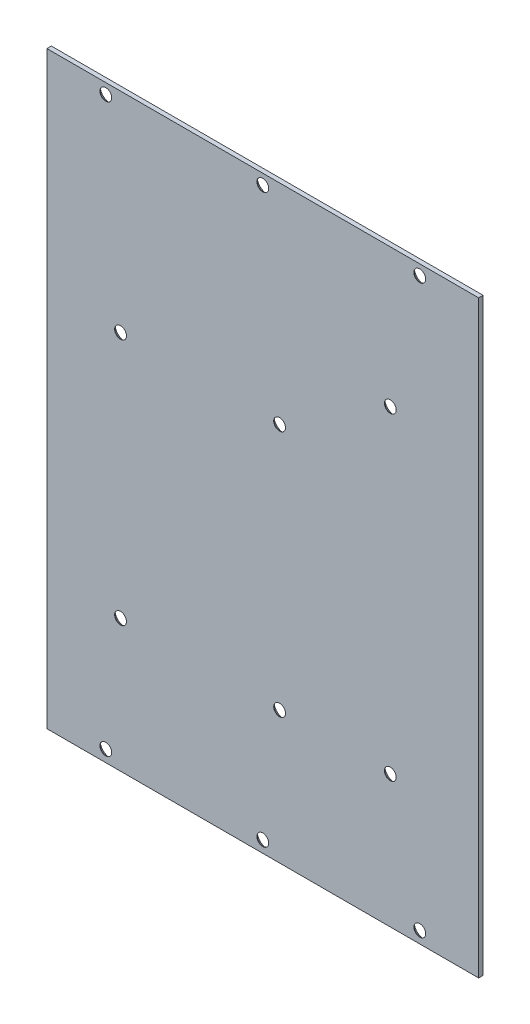
ISO-10303-21;
HEADER;
FILE_DESCRIPTION(('STEP AP214'),'2;1');
FILE_NAME('part.step','',(''),(''),'','','');
FILE_SCHEMA(('AUTOMOTIVE_DESIGN { 1 0 10303 214 1 1 1 1 }'));
ENDSEC;
DATA;
#1=APPLICATION_CONTEXT('core data for automotive mechanical design processes');
#2=APPLICATION_PROTOCOL_DEFINITION('international standard','automotive_design',2000,#1);
#3=PRODUCT_CONTEXT('',#1,'mechanical');
#4=PRODUCT('Part','Part','',(#3));
#5=PRODUCT_RELATED_PRODUCT_CATEGORY('part','',(#4));
#6=PRODUCT_DEFINITION_FORMATION('','',#4);
#7=PRODUCT_DEFINITION_CONTEXT('part definition',#1,'design');
#8=PRODUCT_DEFINITION('design','',#6,#7);
#9=PRODUCT_DEFINITION_SHAPE('','',#8);
#10=(LENGTH_UNIT() NAMED_UNIT(*) SI_UNIT(.MILLI.,.METRE.));
#11=(NAMED_UNIT(*) PLANE_ANGLE_UNIT() SI_UNIT($,.RADIAN.));
#12=(NAMED_UNIT(*) SI_UNIT($,.STERADIAN.) SOLID_ANGLE_UNIT());
#13=UNCERTAINTY_MEASURE_WITH_UNIT(LENGTH_MEASURE(1.E-05),#10,'distance_accuracy_value','');
#14=(GEOMETRIC_REPRESENTATION_CONTEXT(3) GLOBAL_UNCERTAINTY_ASSIGNED_CONTEXT((#13)) GLOBAL_UNIT_ASSIGNED_CONTEXT((#10,
#11,#12)) REPRESENTATION_CONTEXT('',''));
#15=CARTESIAN_POINT('',(0.,0.,0.));
#16=DIRECTION('',(0.,0.,1.));
#17=DIRECTION('',(1.,0.,0.));
#18=AXIS2_PLACEMENT_3D('',#15,#16,#17);
#19=CARTESIAN_POINT('',(0.,0.,1.5));
#20=DIRECTION('',(1.,0.,0.));
#21=DIRECTION('',(0.,1.,0.));
#22=AXIS2_PLACEMENT_3D('',#19,#20,#21);
#23=PLANE('',#22);
#24=DIRECTION('',(0.,-1.,0.));
#25=VECTOR('',#24,1.);
#26=CARTESIAN_POINT('',(0.,0.,0.));
#27=LINE('',#26,#25);
#28=CARTESIAN_POINT('',(0.,200.,0.));
#29=VERTEX_POINT('',#28);
#30=CARTESIAN_POINT('',(0.,0.,0.));
#31=VERTEX_POINT('',#30);
#32=EDGE_CURVE('E105',#29,#31,#27,.T.);
#33=ORIENTED_EDGE('',*,*,#32,.T.);
#34=DIRECTION('',(0.,0.,-1.));
#35=VECTOR('',#34,1.);
#36=CARTESIAN_POINT('',(0.,0.,1.5));
#37=LINE('',#36,#35);
#38=CARTESIAN_POINT('',(0.,0.,1.5));
#39=VERTEX_POINT('',#38);
#40=EDGE_CURVE('E96',#39,#31,#37,.T.);
#41=ORIENTED_EDGE('',*,*,#40,.F.);
#42=DIRECTION('',(0.,-1.,0.));
#43=VECTOR('',#42,1.);
#44=CARTESIAN_POINT('',(0.,0.,1.5));
#45=LINE('',#44,#43);
#46=CARTESIAN_POINT('',(0.,200.,1.5));
#47=VERTEX_POINT('',#46);
#48=EDGE_CURVE('E90',#47,#39,#45,.T.);
#49=ORIENTED_EDGE('',*,*,#48,.F.);
#50=DIRECTION('',(0.,0.,-1.));
#51=VECTOR('',#50,1.);
#52=CARTESIAN_POINT('',(0.,200.,1.5));
#53=LINE('',#52,#51);
#54=EDGE_CURVE('E101',#47,#29,#53,.T.);
#55=ORIENTED_EDGE('',*,*,#54,.T.);
#56=EDGE_LOOP('',(#33,#41,#49,#55));
#57=FACE_BOUND('',#56,.T.);
#58=ADVANCED_FACE('F36',(#57),#23,.F.);
#59=CARTESIAN_POINT('',(0.,0.,1.5));
#60=DIRECTION('',(0.,1.,0.));
#61=DIRECTION('',(0.,0.,1.));
#62=AXIS2_PLACEMENT_3D('',#59,#60,#61);
#63=PLANE('',#62);
#64=DIRECTION('',(1.,0.,0.));
#65=VECTOR('',#64,1.);
#66=CARTESIAN_POINT('',(0.,0.,0.));
#67=LINE('',#66,#65);
#68=CARTESIAN_POINT('',(146.6,0.,0.));
#69=VERTEX_POINT('',#68);
#70=EDGE_CURVE('E95',#31,#69,#67,.T.);
#71=ORIENTED_EDGE('',*,*,#70,.T.);
#72=DIRECTION('',(0.,0.,-1.));
#73=VECTOR('',#72,1.);
#74=CARTESIAN_POINT('',(146.6,0.,1.5));
#75=LINE('',#74,#73);
#76=CARTESIAN_POINT('',(146.6,0.,1.5));
#77=VERTEX_POINT('',#76);
#78=EDGE_CURVE('E93',#77,#69,#75,.T.);
#79=ORIENTED_EDGE('',*,*,#78,.F.);
#80=DIRECTION('',(1.,0.,0.));
#81=VECTOR('',#80,1.);
#82=CARTESIAN_POINT('',(0.,0.,1.5));
#83=LINE('',#82,#81);
#84=EDGE_CURVE('E85',#39,#77,#83,.T.);
#85=ORIENTED_EDGE('',*,*,#84,.F.);
#86=ORIENTED_EDGE('',*,*,#40,.T.);
#87=EDGE_LOOP('',(#71,#79,#85,#86));
#88=FACE_BOUND('',#87,.T.);
#89=ADVANCED_FACE('F94',(#88),#63,.F.);
#90=CARTESIAN_POINT('',(146.6,0.,1.5));
#91=DIRECTION('',(-1.,0.,0.));
#92=DIRECTION('',(0.,-1.,0.));
#93=AXIS2_PLACEMENT_3D('',#90,#91,#92);
#94=PLANE('',#93);
#95=DIRECTION('',(0.,1.,0.));
#96=VECTOR('',#95,1.);
#97=CARTESIAN_POINT('',(146.6,0.,0.));
#98=LINE('',#97,#96);
#99=CARTESIAN_POINT('',(146.6,200.,0.));
#100=VERTEX_POINT('',#99);
#101=EDGE_CURVE('E71',#69,#100,#98,.T.);
#102=ORIENTED_EDGE('',*,*,#101,.T.);
#103=DIRECTION('',(0.,0.,-1.));
#104=VECTOR('',#103,1.);
#105=CARTESIAN_POINT('',(146.6,200.,1.5));
#106=LINE('',#105,#104);
#107=CARTESIAN_POINT('',(146.6,200.,1.5));
#108=VERTEX_POINT('',#107);
#109=EDGE_CURVE('E97',#108,#100,#106,.T.);
#110=ORIENTED_EDGE('',*,*,#109,.F.);
#111=DIRECTION('',(0.,1.,0.));
#112=VECTOR('',#111,1.);
#113=CARTESIAN_POINT('',(146.6,0.,1.5));
#114=LINE('',#113,#112);
#115=EDGE_CURVE('E88',#77,#108,#114,.T.);
#116=ORIENTED_EDGE('',*,*,#115,.F.);
#117=ORIENTED_EDGE('',*,*,#78,.T.);
#118=EDGE_LOOP('',(#102,#110,#116,#117));
#119=FACE_BOUND('',#118,.T.);
#120=ADVANCED_FACE('F99',(#119),#94,.F.);
#121=CARTESIAN_POINT('',(0.,200.,1.5));
#122=DIRECTION('',(0.,-1.,0.));
#123=DIRECTION('',(0.,0.,-1.));
#124=AXIS2_PLACEMENT_3D('',#121,#122,#123);
#125=PLANE('',#124);
#126=DIRECTION('',(-1.,0.,0.));
#127=VECTOR('',#126,1.);
#128=CARTESIAN_POINT('',(0.,200.,0.));
#129=LINE('',#128,#127);
#130=EDGE_CURVE('E77',#100,#29,#129,.T.);
#131=ORIENTED_EDGE('',*,*,#130,.T.);
#132=ORIENTED_EDGE('',*,*,#54,.F.);
#133=DIRECTION('',(-1.,0.,0.));
#134=VECTOR('',#133,1.);
#135=CARTESIAN_POINT('',(0.,200.,1.5));
#136=LINE('',#135,#134);
#137=EDGE_CURVE('E54',#108,#47,#136,.T.);
#138=ORIENTED_EDGE('',*,*,#137,.F.);
#139=ORIENTED_EDGE('',*,*,#109,.T.);
#140=EDGE_LOOP('',(#131,#132,#138,#139));
#141=FACE_BOUND('',#140,.T.);
#142=ADVANCED_FACE('F202',(#141),#125,.F.);
#143=CARTESIAN_POINT('',(0.,0.,1.5));
#144=DIRECTION('',(0.,0.,-1.));
#145=DIRECTION('',(-1.,0.,0.));
#146=AXIS2_PLACEMENT_3D('',#143,#144,#145);
#147=PLANE('',#146);
#148=CARTESIAN_POINT('',(116.6,45.,1.5));
#149=DIRECTION('',(0.,0.,1.));
#150=DIRECTION('',(1.,0.,0.));
#151=AXIS2_PLACEMENT_3D('',#148,#149,#150);
#152=CIRCLE('',#151,2.);
#153=CARTESIAN_POINT('',(118.6,45.,1.5));
#154=VERTEX_POINT('',#153);
#155=EDGE_CURVE('E317',#154,#154,#152,.T.);
#156=ORIENTED_EDGE('',*,*,#155,.F.);
#157=EDGE_LOOP('',(#156));
#158=FACE_BOUND('',#157,.T.);
#159=CARTESIAN_POINT('',(116.6,153.,1.5));
#160=DIRECTION('',(0.,0.,1.));
#161=DIRECTION('',(1.,0.,0.));
#162=AXIS2_PLACEMENT_3D('',#159,#160,#161);
#163=CIRCLE('',#162,2.);
#164=CARTESIAN_POINT('',(118.6,153.,1.5));
#165=VERTEX_POINT('',#164);
#166=EDGE_CURVE('E388',#165,#165,#163,.T.);
#167=ORIENTED_EDGE('',*,*,#166,.F.);
#168=EDGE_LOOP('',(#167));
#169=FACE_BOUND('',#168,.T.);
#170=CARTESIAN_POINT('',(24.9999999999997,129.,1.5));
#171=DIRECTION('',(0.,0.,1.));
#172=DIRECTION('',(1.,0.,0.));
#173=AXIS2_PLACEMENT_3D('',#170,#171,#172);
#174=CIRCLE('',#173,2.00000000000001);
#175=CARTESIAN_POINT('',(26.9999999999997,129.,1.5));
#176=VERTEX_POINT('',#175);
#177=EDGE_CURVE('E311',#176,#176,#174,.T.);
#178=ORIENTED_EDGE('',*,*,#177,.F.);
#179=EDGE_LOOP('',(#178));
#180=FACE_BOUND('',#179,.T.);
#181=CARTESIAN_POINT('',(78.9999999999997,129.,1.5));
#182=DIRECTION('',(0.,0.,1.));
#183=DIRECTION('',(1.,0.,0.));
#184=AXIS2_PLACEMENT_3D('',#181,#182,#183);
#185=CIRCLE('',#184,2.00000000000001);
#186=CARTESIAN_POINT('',(80.9999999999997,129.,1.5));
#187=VERTEX_POINT('',#186);
#188=EDGE_CURVE('E308',#187,#187,#185,.T.);
#189=ORIENTED_EDGE('',*,*,#188,.F.);
#190=EDGE_LOOP('',(#189));
#191=FACE_BOUND('',#190,.T.);
#192=CARTESIAN_POINT('',(79.,45.,1.5));
#193=DIRECTION('',(0.,0.,1.));
#194=DIRECTION('',(1.,0.,0.));
#195=AXIS2_PLACEMENT_3D('',#192,#193,#194);
#196=CIRCLE('',#195,2.);
#197=CARTESIAN_POINT('',(81.,45.,1.5));
#198=VERTEX_POINT('',#197);
#199=EDGE_CURVE('E310',#198,#198,#196,.T.);
#200=ORIENTED_EDGE('',*,*,#199,.F.);
#201=EDGE_LOOP('',(#200));
#202=FACE_BOUND('',#201,.T.);
#203=CARTESIAN_POINT('',(25.,45.,1.5));
#204=DIRECTION('',(0.,0.,1.));
#205=DIRECTION('',(1.,0.,0.));
#206=AXIS2_PLACEMENT_3D('',#203,#204,#205);
#207=CIRCLE('',#206,2.);
#208=CARTESIAN_POINT('',(27.,45.,1.5));
#209=VERTEX_POINT('',#208);
#210=EDGE_CURVE('E314',#209,#209,#207,.T.);
#211=ORIENTED_EDGE('',*,*,#210,.F.);
#212=EDGE_LOOP('',(#211));
#213=FACE_BOUND('',#212,.T.);
#214=CARTESIAN_POINT('',(126.6,4.,1.5));
#215=DIRECTION('',(0.,0.,1.));
#216=DIRECTION('',(1.,0.,0.));
#217=AXIS2_PLACEMENT_3D('',#214,#215,#216);
#218=CIRCLE('',#217,2.00000000000002);
#219=CARTESIAN_POINT('',(128.6,4.,1.5));
#220=VERTEX_POINT('',#219);
#221=EDGE_CURVE('E326',#220,#220,#218,.T.);
#222=ORIENTED_EDGE('',*,*,#221,.F.);
#223=EDGE_LOOP('',(#222));
#224=FACE_BOUND('',#223,.T.);
#225=CARTESIAN_POINT('',(73.3,196.5,1.5));
#226=DIRECTION('',(0.,0.,1.));
#227=DIRECTION('',(1.,0.,0.));
#228=AXIS2_PLACEMENT_3D('',#225,#226,#227);
#229=CIRCLE('',#228,2.00000000000001);
#230=CARTESIAN_POINT('',(75.3,196.5,1.5));
#231=VERTEX_POINT('',#230);
#232=EDGE_CURVE('E327',#231,#231,#229,.T.);
#233=ORIENTED_EDGE('',*,*,#232,.F.);
#234=EDGE_LOOP('',(#233));
#235=FACE_BOUND('',#234,.T.);
#236=CARTESIAN_POINT('',(73.3,4.,1.5));
#237=DIRECTION('',(0.,0.,1.));
#238=DIRECTION('',(1.,0.,0.));
#239=AXIS2_PLACEMENT_3D('',#236,#237,#238);
#240=CIRCLE('',#239,2.);
#241=CARTESIAN_POINT('',(75.3,4.,1.5));
#242=VERTEX_POINT('',#241);
#243=EDGE_CURVE('E330',#242,#242,#240,.T.);
#244=ORIENTED_EDGE('',*,*,#243,.F.);
#245=EDGE_LOOP('',(#244));
#246=FACE_BOUND('',#245,.T.);
#247=CARTESIAN_POINT('',(20.,196.5,1.5));
#248=DIRECTION('',(0.,0.,1.));
#249=DIRECTION('',(1.,0.,0.));
#250=AXIS2_PLACEMENT_3D('',#247,#248,#249);
#251=CIRCLE('',#250,2.);
#252=CARTESIAN_POINT('',(22.,196.5,1.5));
#253=VERTEX_POINT('',#252);
#254=EDGE_CURVE('E333',#253,#253,#251,.T.);
#255=ORIENTED_EDGE('',*,*,#254,.F.);
#256=EDGE_LOOP('',(#255));
#257=FACE_BOUND('',#256,.T.);
#258=CARTESIAN_POINT('',(126.6,196.5,1.5));
#259=DIRECTION('',(0.,0.,1.));
#260=DIRECTION('',(1.,0.,0.));
#261=AXIS2_PLACEMENT_3D('',#258,#259,#260);
#262=CIRCLE('',#261,2.);
#263=CARTESIAN_POINT('',(128.6,196.5,1.5));
#264=VERTEX_POINT('',#263);
#265=EDGE_CURVE('E323',#264,#264,#262,.T.);
#266=ORIENTED_EDGE('',*,*,#265,.F.);
#267=EDGE_LOOP('',(#266));
#268=FACE_BOUND('',#267,.T.);
#269=CARTESIAN_POINT('',(20.,4.,1.5));
#270=DIRECTION('',(0.,0.,1.));
#271=DIRECTION('',(1.,0.,0.));
#272=AXIS2_PLACEMENT_3D('',#269,#270,#271);
#273=CIRCLE('',#272,2.);
#274=CARTESIAN_POINT('',(22.,4.,1.5));
#275=VERTEX_POINT('',#274);
#276=EDGE_CURVE('E108',#275,#275,#273,.T.);
#277=ORIENTED_EDGE('',*,*,#276,.F.);
#278=EDGE_LOOP('',(#277));
#279=FACE_BOUND('',#278,.T.);
#280=ORIENTED_EDGE('',*,*,#48,.T.);
#281=ORIENTED_EDGE('',*,*,#84,.T.);
#282=ORIENTED_EDGE('',*,*,#115,.T.);
#283=ORIENTED_EDGE('',*,*,#137,.T.);
#284=EDGE_LOOP('',(#280,#281,#282,#283));
#285=FACE_BOUND('',#284,.T.);
#286=ADVANCED_FACE('F86',(#158,#169,#180,#191,#202,#213,#224,#235,#246,#257,#268,#279,#285),
#147,.F.);
#287=CARTESIAN_POINT('',(0.,0.,0.));
#288=DIRECTION('',(0.,0.,-1.));
#289=DIRECTION('',(-1.,0.,0.));
#290=AXIS2_PLACEMENT_3D('',#287,#288,#289);
#291=PLANE('',#290);
#292=CARTESIAN_POINT('',(126.6,4.,0.));
#293=DIRECTION('',(0.,0.,-1.));
#294=DIRECTION('',(-1.,0.,0.));
#295=AXIS2_PLACEMENT_3D('',#292,#293,#294);
#296=CIRCLE('',#295,3.40000000000001);
#297=CARTESIAN_POINT('',(123.2,4.,0.));
#298=VERTEX_POINT('',#297);
#299=EDGE_CURVE('E148',#298,#298,#296,.F.);
#300=ORIENTED_EDGE('',*,*,#299,.T.);
#301=EDGE_LOOP('',(#300));
#302=FACE_BOUND('',#301,.T.);
#303=CARTESIAN_POINT('',(116.6,45.,0.));
#304=DIRECTION('',(0.,0.,-1.));
#305=DIRECTION('',(-1.,0.,0.));
#306=AXIS2_PLACEMENT_3D('',#303,#304,#305);
#307=CIRCLE('',#306,3.40000000000001);
#308=CARTESIAN_POINT('',(113.2,45.,0.));
#309=VERTEX_POINT('',#308);
#310=EDGE_CURVE('E145',#309,#309,#307,.F.);
#311=ORIENTED_EDGE('',*,*,#310,.T.);
#312=EDGE_LOOP('',(#311));
#313=FACE_BOUND('',#312,.T.);
#314=CARTESIAN_POINT('',(79.,45.,0.));
#315=DIRECTION('',(0.,0.,-1.));
#316=DIRECTION('',(-1.,0.,0.));
#317=AXIS2_PLACEMENT_3D('',#314,#315,#316);
#318=CIRCLE('',#317,3.40000000000001);
#319=CARTESIAN_POINT('',(75.6,45.,0.));
#320=VERTEX_POINT('',#319);
#321=EDGE_CURVE('E142',#320,#320,#318,.F.);
#322=ORIENTED_EDGE('',*,*,#321,.T.);
#323=EDGE_LOOP('',(#322));
#324=FACE_BOUND('',#323,.T.);
#325=CARTESIAN_POINT('',(73.3,4.,0.));
#326=DIRECTION('',(0.,0.,-1.));
#327=DIRECTION('',(-1.,0.,0.));
#328=AXIS2_PLACEMENT_3D('',#325,#326,#327);
#329=CIRCLE('',#328,3.40000000000001);
#330=CARTESIAN_POINT('',(69.9,4.,0.));
#331=VERTEX_POINT('',#330);
#332=EDGE_CURVE('E139',#331,#331,#329,.F.);
#333=ORIENTED_EDGE('',*,*,#332,.T.);
#334=EDGE_LOOP('',(#333));
#335=FACE_BOUND('',#334,.T.);
#336=CARTESIAN_POINT('',(20.,4.,0.));
#337=DIRECTION('',(0.,0.,-1.));
#338=DIRECTION('',(-1.,0.,0.));
#339=AXIS2_PLACEMENT_3D('',#336,#337,#338);
#340=CIRCLE('',#339,3.39999999999999);
#341=CARTESIAN_POINT('',(16.6,4.,0.));
#342=VERTEX_POINT('',#341);
#343=EDGE_CURVE('E136',#342,#342,#340,.F.);
#344=ORIENTED_EDGE('',*,*,#343,.T.);
#345=EDGE_LOOP('',(#344));
#346=FACE_BOUND('',#345,.T.);
#347=CARTESIAN_POINT('',(25.,45.,0.));
#348=DIRECTION('',(0.,0.,-1.));
#349=DIRECTION('',(-1.,0.,0.));
#350=AXIS2_PLACEMENT_3D('',#347,#348,#349);
#351=CIRCLE('',#350,3.39999999999999);
#352=CARTESIAN_POINT('',(21.6,45.,0.));
#353=VERTEX_POINT('',#352);
#354=EDGE_CURVE('E133',#353,#353,#351,.F.);
#355=ORIENTED_EDGE('',*,*,#354,.T.);
#356=EDGE_LOOP('',(#355));
#357=FACE_BOUND('',#356,.T.);
#358=CARTESIAN_POINT('',(24.9999999999997,129.,0.));
#359=DIRECTION('',(0.,0.,-1.));
#360=DIRECTION('',(-1.,0.,0.));
#361=AXIS2_PLACEMENT_3D('',#358,#359,#360);
#362=CIRCLE('',#361,3.39999999999999);
#363=CARTESIAN_POINT('',(21.5999999999997,129.,0.));
#364=VERTEX_POINT('',#363);
#365=EDGE_CURVE('E130',#364,#364,#362,.F.);
#366=ORIENTED_EDGE('',*,*,#365,.T.);
#367=EDGE_LOOP('',(#366));
#368=FACE_BOUND('',#367,.T.);
#369=CARTESIAN_POINT('',(20.,196.5,0.));
#370=DIRECTION('',(0.,0.,-1.));
#371=DIRECTION('',(-1.,0.,0.));
#372=AXIS2_PLACEMENT_3D('',#369,#370,#371);
#373=CIRCLE('',#372,3.39999999999999);
#374=CARTESIAN_POINT('',(16.6,196.5,0.));
#375=VERTEX_POINT('',#374);
#376=EDGE_CURVE('E127',#375,#375,#373,.F.);
#377=ORIENTED_EDGE('',*,*,#376,.T.);
#378=EDGE_LOOP('',(#377));
#379=FACE_BOUND('',#378,.T.);
#380=CARTESIAN_POINT('',(73.3,196.5,0.));
#381=DIRECTION('',(0.,0.,-1.));
#382=DIRECTION('',(-1.,0.,0.));
#383=AXIS2_PLACEMENT_3D('',#380,#381,#382);
#384=CIRCLE('',#383,3.40000000000001);
#385=CARTESIAN_POINT('',(69.8999999999999,196.5,0.));
#386=VERTEX_POINT('',#385);
#387=EDGE_CURVE('E124',#386,#386,#384,.F.);
#388=ORIENTED_EDGE('',*,*,#387,.T.);
#389=EDGE_LOOP('',(#388));
#390=FACE_BOUND('',#389,.T.);
#391=CARTESIAN_POINT('',(78.9999999999997,129.,0.));
#392=DIRECTION('',(0.,0.,-1.));
#393=DIRECTION('',(-1.,0.,0.));
#394=AXIS2_PLACEMENT_3D('',#391,#392,#393);
#395=CIRCLE('',#394,3.40000000000001);
#396=CARTESIAN_POINT('',(75.5999999999997,129.,0.));
#397=VERTEX_POINT('',#396);
#398=EDGE_CURVE('E121',#397,#397,#395,.F.);
#399=ORIENTED_EDGE('',*,*,#398,.T.);
#400=EDGE_LOOP('',(#399));
#401=FACE_BOUND('',#400,.T.);
#402=CARTESIAN_POINT('',(116.6,153.,0.));
#403=DIRECTION('',(0.,0.,-1.));
#404=DIRECTION('',(-1.,0.,0.));
#405=AXIS2_PLACEMENT_3D('',#402,#403,#404);
#406=CIRCLE('',#405,3.40000000000001);
#407=CARTESIAN_POINT('',(113.2,153.,0.));
#408=VERTEX_POINT('',#407);
#409=EDGE_CURVE('E118',#408,#408,#406,.F.);
#410=ORIENTED_EDGE('',*,*,#409,.T.);
#411=EDGE_LOOP('',(#410));
#412=FACE_BOUND('',#411,.T.);
#413=CARTESIAN_POINT('',(126.6,196.5,0.));
#414=DIRECTION('',(0.,0.,-1.));
#415=DIRECTION('',(-1.,0.,0.));
#416=AXIS2_PLACEMENT_3D('',#413,#414,#415);
#417=CIRCLE('',#416,3.39999999999996);
#418=CARTESIAN_POINT('',(123.2,196.5,0.));
#419=VERTEX_POINT('',#418);
#420=EDGE_CURVE('E115',#419,#419,#417,.F.);
#421=ORIENTED_EDGE('',*,*,#420,.T.);
#422=EDGE_LOOP('',(#421));
#423=FACE_BOUND('',#422,.T.);
#424=ORIENTED_EDGE('',*,*,#32,.F.);
#425=ORIENTED_EDGE('',*,*,#130,.F.);
#426=ORIENTED_EDGE('',*,*,#101,.F.);
#427=ORIENTED_EDGE('',*,*,#70,.F.);
#428=EDGE_LOOP('',(#424,#425,#426,#427));
#429=FACE_BOUND('',#428,.T.);
#430=ADVANCED_FACE('F192',(#302,#313,#324,#335,#346,#357,#368,#379,#390,#401,#412,#423,#429),
#291,.T.);
#431=CARTESIAN_POINT('',(20.,4.,0.));
#432=DIRECTION('',(0.,0.,1.));
#433=DIRECTION('',(1.,0.,0.));
#434=AXIS2_PLACEMENT_3D('',#431,#432,#433);
#435=CYLINDRICAL_SURFACE('',#434,2.);
#436=CARTESIAN_POINT('',(20.,4.,1.40000000000001));
#437=DIRECTION('',(0.,0.,-1.));
#438=DIRECTION('',(-1.,0.,0.));
#439=AXIS2_PLACEMENT_3D('',#436,#437,#438);
#440=CIRCLE('',#439,2.);
#441=CARTESIAN_POINT('',(18.,4.,1.40000000000001));
#442=VERTEX_POINT('',#441);
#443=EDGE_CURVE('E163',#442,#442,#440,.T.);
#444=ORIENTED_EDGE('',*,*,#443,.T.);
#445=EDGE_LOOP('',(#444));
#446=FACE_BOUND('',#445,.T.);
#447=ORIENTED_EDGE('',*,*,#276,.T.);
#448=EDGE_LOOP('',(#447));
#449=FACE_BOUND('',#448,.T.);
#450=ADVANCED_FACE('F195',(#446,#449),#435,.F.);
#451=CARTESIAN_POINT('',(126.6,196.5,0.));
#452=DIRECTION('',(0.,0.,1.));
#453=DIRECTION('',(1.,0.,0.));
#454=AXIS2_PLACEMENT_3D('',#451,#452,#453);
#455=CYLINDRICAL_SURFACE('',#454,2.);
#456=CARTESIAN_POINT('',(126.6,196.5,1.39999999999997));
#457=DIRECTION('',(0.,0.,-1.));
#458=DIRECTION('',(-1.,0.,0.));
#459=AXIS2_PLACEMENT_3D('',#456,#457,#458);
#460=CIRCLE('',#459,2.);
#461=CARTESIAN_POINT('',(124.6,196.5,1.39999999999997));
#462=VERTEX_POINT('',#461);
#463=EDGE_CURVE('E11',#462,#462,#460,.T.);
#464=ORIENTED_EDGE('',*,*,#463,.T.);
#465=EDGE_LOOP('',(#464));
#466=FACE_BOUND('',#465,.T.);
#467=ORIENTED_EDGE('',*,*,#265,.T.);
#468=EDGE_LOOP('',(#467));
#469=FACE_BOUND('',#468,.T.);
#470=ADVANCED_FACE('F343',(#466,#469),#455,.F.);
#471=CARTESIAN_POINT('',(20.,196.5,0.));
#472=DIRECTION('',(0.,0.,1.));
#473=DIRECTION('',(1.,0.,0.));
#474=AXIS2_PLACEMENT_3D('',#471,#472,#473);
#475=CYLINDRICAL_SURFACE('',#474,2.);
#476=CARTESIAN_POINT('',(20.,196.5,1.40000000000001));
#477=DIRECTION('',(0.,0.,-1.));
#478=DIRECTION('',(-1.,0.,0.));
#479=AXIS2_PLACEMENT_3D('',#476,#477,#478);
#480=CIRCLE('',#479,2.);
#481=CARTESIAN_POINT('',(18.,196.5,1.40000000000001));
#482=VERTEX_POINT('',#481);
#483=EDGE_CURVE('E172',#482,#482,#480,.T.);
#484=ORIENTED_EDGE('',*,*,#483,.T.);
#485=EDGE_LOOP('',(#484));
#486=FACE_BOUND('',#485,.T.);
#487=ORIENTED_EDGE('',*,*,#254,.T.);
#488=EDGE_LOOP('',(#487));
#489=FACE_BOUND('',#488,.T.);
#490=ADVANCED_FACE('F349',(#486,#489),#475,.F.);
#491=CARTESIAN_POINT('',(73.3,4.,0.));
#492=DIRECTION('',(0.,0.,1.));
#493=DIRECTION('',(1.,0.,0.));
#494=AXIS2_PLACEMENT_3D('',#491,#492,#493);
#495=CYLINDRICAL_SURFACE('',#494,2.);
#496=CARTESIAN_POINT('',(73.3,4.,1.4));
#497=DIRECTION('',(0.,0.,-1.));
#498=DIRECTION('',(-1.,0.,0.));
#499=AXIS2_PLACEMENT_3D('',#496,#497,#498);
#500=CIRCLE('',#499,2.);
#501=CARTESIAN_POINT('',(71.3,4.,1.4));
#502=VERTEX_POINT('',#501);
#503=EDGE_CURVE('E160',#502,#502,#500,.T.);
#504=ORIENTED_EDGE('',*,*,#503,.T.);
#505=EDGE_LOOP('',(#504));
#506=FACE_BOUND('',#505,.T.);
#507=ORIENTED_EDGE('',*,*,#243,.T.);
#508=EDGE_LOOP('',(#507));
#509=FACE_BOUND('',#508,.T.);
#510=ADVANCED_FACE('F353',(#506,#509),#495,.F.);
#511=CARTESIAN_POINT('',(73.3,196.5,0.));
#512=DIRECTION('',(0.,0.,1.));
#513=DIRECTION('',(1.,0.,0.));
#514=AXIS2_PLACEMENT_3D('',#511,#512,#513);
#515=CYLINDRICAL_SURFACE('',#514,2.00000000000001);
#516=CARTESIAN_POINT('',(73.3,196.5,1.39999999999998));
#517=DIRECTION('',(0.,0.,-1.));
#518=DIRECTION('',(-1.,0.,0.));
#519=AXIS2_PLACEMENT_3D('',#516,#517,#518);
#520=CIRCLE('',#519,2.00000000000001);
#521=CARTESIAN_POINT('',(71.2999999999999,196.5,1.39999999999998));
#522=VERTEX_POINT('',#521);
#523=EDGE_CURVE('E175',#522,#522,#520,.T.);
#524=ORIENTED_EDGE('',*,*,#523,.T.);
#525=EDGE_LOOP('',(#524));
#526=FACE_BOUND('',#525,.T.);
#527=ORIENTED_EDGE('',*,*,#232,.T.);
#528=EDGE_LOOP('',(#527));
#529=FACE_BOUND('',#528,.T.);
#530=ADVANCED_FACE('F356',(#526,#529),#515,.F.);
#531=CARTESIAN_POINT('',(126.6,4.,0.));
#532=DIRECTION('',(0.,0.,1.));
#533=DIRECTION('',(1.,0.,0.));
#534=AXIS2_PLACEMENT_3D('',#531,#532,#533);
#535=CYLINDRICAL_SURFACE('',#534,2.00000000000002);
#536=CARTESIAN_POINT('',(126.6,4.,1.39999999999997));
#537=DIRECTION('',(0.,0.,-1.));
#538=DIRECTION('',(-1.,0.,0.));
#539=AXIS2_PLACEMENT_3D('',#536,#537,#538);
#540=CIRCLE('',#539,2.00000000000002);
#541=CARTESIAN_POINT('',(124.6,4.,1.39999999999997));
#542=VERTEX_POINT('',#541);
#543=EDGE_CURVE('E151',#542,#542,#540,.T.);
#544=ORIENTED_EDGE('',*,*,#543,.T.);
#545=EDGE_LOOP('',(#544));
#546=FACE_BOUND('',#545,.T.);
#547=ORIENTED_EDGE('',*,*,#221,.T.);
#548=EDGE_LOOP('',(#547));
#549=FACE_BOUND('',#548,.T.);
#550=ADVANCED_FACE('F361',(#546,#549),#535,.F.);
#551=CARTESIAN_POINT('',(25.,45.,0.));
#552=DIRECTION('',(0.,0.,1.));
#553=DIRECTION('',(1.,0.,0.));
#554=AXIS2_PLACEMENT_3D('',#551,#552,#553);
#555=CYLINDRICAL_SURFACE('',#554,2.);
#556=CARTESIAN_POINT('',(25.,45.,1.40000000000001));
#557=DIRECTION('',(0.,0.,-1.));
#558=DIRECTION('',(-1.,0.,0.));
#559=AXIS2_PLACEMENT_3D('',#556,#557,#558);
#560=CIRCLE('',#559,2.);
#561=CARTESIAN_POINT('',(23.,45.,1.40000000000001));
#562=VERTEX_POINT('',#561);
#563=EDGE_CURVE('E166',#562,#562,#560,.T.);
#564=ORIENTED_EDGE('',*,*,#563,.T.);
#565=EDGE_LOOP('',(#564));
#566=FACE_BOUND('',#565,.T.);
#567=ORIENTED_EDGE('',*,*,#210,.T.);
#568=EDGE_LOOP('',(#567));
#569=FACE_BOUND('',#568,.T.);
#570=ADVANCED_FACE('F364',(#566,#569),#555,.F.);
#571=CARTESIAN_POINT('',(79.,45.,0.));
#572=DIRECTION('',(0.,0.,1.));
#573=DIRECTION('',(1.,0.,0.));
#574=AXIS2_PLACEMENT_3D('',#571,#572,#573);
#575=CYLINDRICAL_SURFACE('',#574,2.);
#576=CARTESIAN_POINT('',(79.,45.,1.4));
#577=DIRECTION('',(0.,0.,-1.));
#578=DIRECTION('',(-1.,0.,0.));
#579=AXIS2_PLACEMENT_3D('',#576,#577,#578);
#580=CIRCLE('',#579,2.);
#581=CARTESIAN_POINT('',(77.,45.,1.4));
#582=VERTEX_POINT('',#581);
#583=EDGE_CURVE('E157',#582,#582,#580,.T.);
#584=ORIENTED_EDGE('',*,*,#583,.T.);
#585=EDGE_LOOP('',(#584));
#586=FACE_BOUND('',#585,.T.);
#587=ORIENTED_EDGE('',*,*,#199,.T.);
#588=EDGE_LOOP('',(#587));
#589=FACE_BOUND('',#588,.T.);
#590=ADVANCED_FACE('F304',(#586,#589),#575,.F.);
#591=CARTESIAN_POINT('',(78.9999999999997,129.,0.));
#592=DIRECTION('',(0.,0.,1.));
#593=DIRECTION('',(1.,0.,0.));
#594=AXIS2_PLACEMENT_3D('',#591,#592,#593);
#595=CYLINDRICAL_SURFACE('',#594,2.00000000000001);
#596=CARTESIAN_POINT('',(78.9999999999997,129.,1.39999999999998));
#597=DIRECTION('',(0.,0.,-1.));
#598=DIRECTION('',(-1.,0.,0.));
#599=AXIS2_PLACEMENT_3D('',#596,#597,#598);
#600=CIRCLE('',#599,2.00000000000001);
#601=CARTESIAN_POINT('',(76.9999999999997,129.,1.39999999999998));
#602=VERTEX_POINT('',#601);
#603=EDGE_CURVE('E178',#602,#602,#600,.T.);
#604=ORIENTED_EDGE('',*,*,#603,.T.);
#605=EDGE_LOOP('',(#604));
#606=FACE_BOUND('',#605,.T.);
#607=ORIENTED_EDGE('',*,*,#188,.T.);
#608=EDGE_LOOP('',(#607));
#609=FACE_BOUND('',#608,.T.);
#610=ADVANCED_FACE('F300',(#606,#609),#595,.F.);
#611=CARTESIAN_POINT('',(24.9999999999997,129.,0.));
#612=DIRECTION('',(0.,0.,1.));
#613=DIRECTION('',(1.,0.,0.));
#614=AXIS2_PLACEMENT_3D('',#611,#612,#613);
#615=CYLINDRICAL_SURFACE('',#614,2.00000000000001);
#616=CARTESIAN_POINT('',(24.9999999999997,129.,1.4));
#617=DIRECTION('',(0.,0.,-1.));
#618=DIRECTION('',(-1.,0.,0.));
#619=AXIS2_PLACEMENT_3D('',#616,#617,#618);
#620=CIRCLE('',#619,2.00000000000001);
#621=CARTESIAN_POINT('',(22.9999999999997,129.,1.4));
#622=VERTEX_POINT('',#621);
#623=EDGE_CURVE('E169',#622,#622,#620,.T.);
#624=ORIENTED_EDGE('',*,*,#623,.T.);
#625=EDGE_LOOP('',(#624));
#626=FACE_BOUND('',#625,.T.);
#627=ORIENTED_EDGE('',*,*,#177,.T.);
#628=EDGE_LOOP('',(#627));
#629=FACE_BOUND('',#628,.T.);
#630=ADVANCED_FACE('F303',(#626,#629),#615,.F.);
#631=CARTESIAN_POINT('',(116.6,153.,0.));
#632=DIRECTION('',(0.,0.,1.));
#633=DIRECTION('',(1.,0.,0.));
#634=AXIS2_PLACEMENT_3D('',#631,#632,#633);
#635=CYLINDRICAL_SURFACE('',#634,2.);
#636=CARTESIAN_POINT('',(116.6,153.,1.4));
#637=DIRECTION('',(0.,0.,-1.));
#638=DIRECTION('',(-1.,0.,0.));
#639=AXIS2_PLACEMENT_3D('',#636,#637,#638);
#640=CIRCLE('',#639,2.);
#641=CARTESIAN_POINT('',(114.6,153.,1.4));
#642=VERTEX_POINT('',#641);
#643=EDGE_CURVE('E46',#642,#642,#640,.T.);
#644=ORIENTED_EDGE('',*,*,#643,.T.);
#645=EDGE_LOOP('',(#644));
#646=FACE_BOUND('',#645,.T.);
#647=ORIENTED_EDGE('',*,*,#166,.T.);
#648=EDGE_LOOP('',(#647));
#649=FACE_BOUND('',#648,.T.);
#650=ADVANCED_FACE('F183',(#646,#649),#635,.F.);
#651=CARTESIAN_POINT('',(116.6,45.,0.));
#652=DIRECTION('',(0.,0.,1.));
#653=DIRECTION('',(1.,0.,0.));
#654=AXIS2_PLACEMENT_3D('',#651,#652,#653);
#655=CYLINDRICAL_SURFACE('',#654,2.);
#656=CARTESIAN_POINT('',(116.6,45.,1.4));
#657=DIRECTION('',(0.,0.,-1.));
#658=DIRECTION('',(-1.,0.,0.));
#659=AXIS2_PLACEMENT_3D('',#656,#657,#658);
#660=CIRCLE('',#659,2.);
#661=CARTESIAN_POINT('',(114.6,45.,1.4));
#662=VERTEX_POINT('',#661);
#663=EDGE_CURVE('E154',#662,#662,#660,.T.);
#664=ORIENTED_EDGE('',*,*,#663,.T.);
#665=EDGE_LOOP('',(#664));
#666=FACE_BOUND('',#665,.T.);
#667=ORIENTED_EDGE('',*,*,#155,.T.);
#668=EDGE_LOOP('',(#667));
#669=FACE_BOUND('',#668,.T.);
#670=ADVANCED_FACE('F227',(#666,#669),#655,.F.);
#671=CARTESIAN_POINT('',(126.6,4.,0.));
#672=DIRECTION('',(0.,0.,-1.));
#673=DIRECTION('',(-1.,0.,0.));
#674=AXIS2_PLACEMENT_3D('',#671,#672,#673);
#675=CONICAL_SURFACE('',#674,3.40000000000001,0.785398163397456);
#676=ORIENTED_EDGE('',*,*,#543,.F.);
#677=EDGE_LOOP('',(#676));
#678=FACE_BOUND('',#677,.T.);
#679=ORIENTED_EDGE('',*,*,#299,.F.);
#680=EDGE_LOOP('',(#679));
#681=FACE_BOUND('',#680,.T.);
#682=ADVANCED_FACE('F220',(#678,#681),#675,.F.);
#683=CARTESIAN_POINT('',(116.6,45.,0.));
#684=DIRECTION('',(0.,0.,-1.));
#685=DIRECTION('',(-1.,0.,0.));
#686=AXIS2_PLACEMENT_3D('',#683,#684,#685);
#687=CONICAL_SURFACE('',#686,3.40000000000001,0.785398163397456);
#688=ORIENTED_EDGE('',*,*,#663,.F.);
#689=EDGE_LOOP('',(#688));
#690=FACE_BOUND('',#689,.T.);
#691=ORIENTED_EDGE('',*,*,#310,.F.);
#692=EDGE_LOOP('',(#691));
#693=FACE_BOUND('',#692,.T.);
#694=ADVANCED_FACE('F226',(#690,#693),#687,.F.);
#695=CARTESIAN_POINT('',(79.,45.,0.));
#696=DIRECTION('',(0.,0.,-1.));
#697=DIRECTION('',(-1.,0.,0.));
#698=AXIS2_PLACEMENT_3D('',#695,#696,#697);
#699=CONICAL_SURFACE('',#698,3.40000000000001,0.785398163397456);
#700=ORIENTED_EDGE('',*,*,#583,.F.);
#701=EDGE_LOOP('',(#700));
#702=FACE_BOUND('',#701,.T.);
#703=ORIENTED_EDGE('',*,*,#321,.F.);
#704=EDGE_LOOP('',(#703));
#705=FACE_BOUND('',#704,.T.);
#706=ADVANCED_FACE('F234',(#702,#705),#699,.F.);
#707=CARTESIAN_POINT('',(73.3,4.,0.));
#708=DIRECTION('',(0.,0.,-1.));
#709=DIRECTION('',(-1.,0.,0.));
#710=AXIS2_PLACEMENT_3D('',#707,#708,#709);
#711=CONICAL_SURFACE('',#710,3.40000000000001,0.785398163397456);
#712=ORIENTED_EDGE('',*,*,#503,.F.);
#713=EDGE_LOOP('',(#712));
#714=FACE_BOUND('',#713,.T.);
#715=ORIENTED_EDGE('',*,*,#332,.F.);
#716=EDGE_LOOP('',(#715));
#717=FACE_BOUND('',#716,.T.);
#718=ADVANCED_FACE('F241',(#714,#717),#711,.F.);
#719=CARTESIAN_POINT('',(20.,4.,0.));
#720=DIRECTION('',(0.,0.,-1.));
#721=DIRECTION('',(-1.,0.,0.));
#722=AXIS2_PLACEMENT_3D('',#719,#720,#721);
#723=CONICAL_SURFACE('',#722,3.39999999999999,0.78539816339744);
#724=ORIENTED_EDGE('',*,*,#443,.F.);
#725=EDGE_LOOP('',(#724));
#726=FACE_BOUND('',#725,.T.);
#727=ORIENTED_EDGE('',*,*,#343,.F.);
#728=EDGE_LOOP('',(#727));
#729=FACE_BOUND('',#728,.T.);
#730=ADVANCED_FACE('F248',(#726,#729),#723,.F.);
#731=CARTESIAN_POINT('',(25.,45.,0.));
#732=DIRECTION('',(0.,0.,-1.));
#733=DIRECTION('',(-1.,0.,0.));
#734=AXIS2_PLACEMENT_3D('',#731,#732,#733);
#735=CONICAL_SURFACE('',#734,3.39999999999999,0.78539816339744);
#736=ORIENTED_EDGE('',*,*,#563,.F.);
#737=EDGE_LOOP('',(#736));
#738=FACE_BOUND('',#737,.T.);
#739=ORIENTED_EDGE('',*,*,#354,.F.);
#740=EDGE_LOOP('',(#739));
#741=FACE_BOUND('',#740,.T.);
#742=ADVANCED_FACE('F255',(#738,#741),#735,.F.);
#743=CARTESIAN_POINT('',(24.9999999999997,129.,0.));
#744=DIRECTION('',(0.,0.,-1.));
#745=DIRECTION('',(-1.,0.,0.));
#746=AXIS2_PLACEMENT_3D('',#743,#744,#745);
#747=CONICAL_SURFACE('',#746,3.39999999999999,0.78539816339744);
#748=ORIENTED_EDGE('',*,*,#623,.F.);
#749=EDGE_LOOP('',(#748));
#750=FACE_BOUND('',#749,.T.);
#751=ORIENTED_EDGE('',*,*,#365,.F.);
#752=EDGE_LOOP('',(#751));
#753=FACE_BOUND('',#752,.T.);
#754=ADVANCED_FACE('F262',(#750,#753),#747,.F.);
#755=CARTESIAN_POINT('',(20.,196.5,0.));
#756=DIRECTION('',(0.,0.,-1.));
#757=DIRECTION('',(-1.,0.,0.));
#758=AXIS2_PLACEMENT_3D('',#755,#756,#757);
#759=CONICAL_SURFACE('',#758,3.39999999999999,0.78539816339744);
#760=ORIENTED_EDGE('',*,*,#483,.F.);
#761=EDGE_LOOP('',(#760));
#762=FACE_BOUND('',#761,.T.);
#763=ORIENTED_EDGE('',*,*,#376,.F.);
#764=EDGE_LOOP('',(#763));
#765=FACE_BOUND('',#764,.T.);
#766=ADVANCED_FACE('F269',(#762,#765),#759,.F.);
#767=CARTESIAN_POINT('',(73.3,196.5,0.));
#768=DIRECTION('',(0.,0.,-1.));
#769=DIRECTION('',(-1.,0.,0.));
#770=AXIS2_PLACEMENT_3D('',#767,#768,#769);
#771=CONICAL_SURFACE('',#770,3.40000000000001,0.785398163397456);
#772=ORIENTED_EDGE('',*,*,#523,.F.);
#773=EDGE_LOOP('',(#772));
#774=FACE_BOUND('',#773,.T.);
#775=ORIENTED_EDGE('',*,*,#387,.F.);
#776=EDGE_LOOP('',(#775));
#777=FACE_BOUND('',#776,.T.);
#778=ADVANCED_FACE('F276',(#774,#777),#771,.F.);
#779=CARTESIAN_POINT('',(78.9999999999997,129.,0.));
#780=DIRECTION('',(0.,0.,-1.));
#781=DIRECTION('',(-1.,0.,0.));
#782=AXIS2_PLACEMENT_3D('',#779,#780,#781);
#783=CONICAL_SURFACE('',#782,3.40000000000001,0.785398163397456);
#784=ORIENTED_EDGE('',*,*,#603,.F.);
#785=EDGE_LOOP('',(#784));
#786=FACE_BOUND('',#785,.T.);
#787=ORIENTED_EDGE('',*,*,#398,.F.);
#788=EDGE_LOOP('',(#787));
#789=FACE_BOUND('',#788,.T.);
#790=ADVANCED_FACE('F189',(#786,#789),#783,.F.);
#791=CARTESIAN_POINT('',(116.6,153.,0.));
#792=DIRECTION('',(0.,0.,-1.));
#793=DIRECTION('',(-1.,0.,0.));
#794=AXIS2_PLACEMENT_3D('',#791,#792,#793);
#795=CONICAL_SURFACE('',#794,3.40000000000001,0.785398163397456);
#796=ORIENTED_EDGE('',*,*,#643,.F.);
#797=EDGE_LOOP('',(#796));
#798=FACE_BOUND('',#797,.T.);
#799=ORIENTED_EDGE('',*,*,#409,.F.);
#800=EDGE_LOOP('',(#799));
#801=FACE_BOUND('',#800,.T.);
#802=ADVANCED_FACE('F186',(#798,#801),#795,.F.);
#803=CARTESIAN_POINT('',(126.6,196.5,0.));
#804=DIRECTION('',(0.,0.,-1.));
#805=DIRECTION('',(-1.,0.,0.));
#806=AXIS2_PLACEMENT_3D('',#803,#804,#805);
#807=CONICAL_SURFACE('',#806,3.39999999999996,0.785398163397446);
#808=ORIENTED_EDGE('',*,*,#463,.F.);
#809=EDGE_LOOP('',(#808));
#810=FACE_BOUND('',#809,.T.);
#811=ORIENTED_EDGE('',*,*,#420,.F.);
#812=EDGE_LOOP('',(#811));
#813=FACE_BOUND('',#812,.T.);
#814=ADVANCED_FACE('F39',(#810,#813),#807,.F.);
#815=CLOSED_SHELL('',(#58,#89,#120,#142,#286,#430,#450,#470,#490,#510,#530,#550,#570,#590,#610,
#630,#650,#670,#682,#694,#706,#718,#730,#742,#754,#766,#778,#790,#802,#814));
#816=MANIFOLD_SOLID_BREP('B2',#815);
#817=ADVANCED_BREP_SHAPE_REPRESENTATION('',(#18,#816),#14);
#818=SHAPE_DEFINITION_REPRESENTATION(#9,#817);
ENDSEC;
END-ISO-10303-21;
